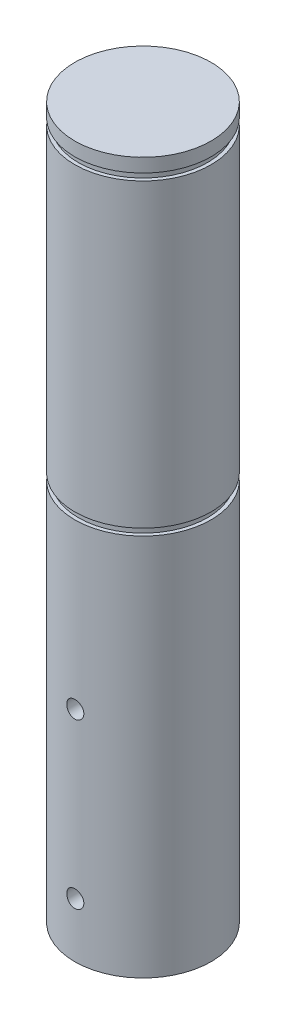
ISO-10303-21;
HEADER;
FILE_DESCRIPTION(('STEP AP214'),'2;1');
FILE_NAME('part.step','',(''),(''),'','','');
FILE_SCHEMA(('AUTOMOTIVE_DESIGN { 1 0 10303 214 1 1 1 1 }'));
ENDSEC;
DATA;
#1=APPLICATION_CONTEXT('core data for automotive mechanical design processes');
#2=APPLICATION_PROTOCOL_DEFINITION('international standard','automotive_design',2000,#1);
#3=PRODUCT_CONTEXT('',#1,'mechanical');
#4=PRODUCT('Part','Part','',(#3));
#5=PRODUCT_RELATED_PRODUCT_CATEGORY('part','',(#4));
#6=PRODUCT_DEFINITION_FORMATION('','',#4);
#7=PRODUCT_DEFINITION_CONTEXT('part definition',#1,'design');
#8=PRODUCT_DEFINITION('design','',#6,#7);
#9=PRODUCT_DEFINITION_SHAPE('','',#8);
#10=(LENGTH_UNIT() NAMED_UNIT(*) SI_UNIT(.MILLI.,.METRE.));
#11=(NAMED_UNIT(*) PLANE_ANGLE_UNIT() SI_UNIT($,.RADIAN.));
#12=(NAMED_UNIT(*) SI_UNIT($,.STERADIAN.) SOLID_ANGLE_UNIT());
#13=UNCERTAINTY_MEASURE_WITH_UNIT(LENGTH_MEASURE(1.E-05),#10,'distance_accuracy_value','');
#14=(GEOMETRIC_REPRESENTATION_CONTEXT(3) GLOBAL_UNCERTAINTY_ASSIGNED_CONTEXT((#13)) GLOBAL_UNIT_ASSIGNED_CONTEXT((#10,
#11,#12)) REPRESENTATION_CONTEXT('',''));
#15=CARTESIAN_POINT('',(0.,0.,0.));
#16=DIRECTION('',(0.,0.,1.));
#17=DIRECTION('',(1.,0.,0.));
#18=AXIS2_PLACEMENT_3D('',#15,#16,#17);
#19=CARTESIAN_POINT('',(5.9,40.,0.));
#20=DIRECTION('',(0.,-1.,0.));
#21=DIRECTION('',(0.,0.,-1.));
#22=AXIS2_PLACEMENT_3D('',#19,#20,#21);
#23=CYLINDRICAL_SURFACE('',#22,9.975);
#24=CARTESIAN_POINT('',(7.14999999999999,32.,9.89636928373229));
#25=CARTESIAN_POINT('',(7.1499970283447,31.9300833414179,9.89637029027922));
#26=CARTESIAN_POINT('',(7.14411419874699,31.8601230204867,9.8971182134243));
#27=CARTESIAN_POINT('',(7.12073950074832,31.7221494896786,9.90002795154952));
#28=CARTESIAN_POINT('',(7.10323551057745,31.6541383903444,9.9021912428339));
#29=CARTESIAN_POINT('',(7.05714271229177,31.5220809048803,9.9076829276249));
#30=CARTESIAN_POINT('',(7.02856143874438,31.4580318580989,9.91101052903963));
#31=CARTESIAN_POINT('',(6.96114153202213,31.3356510610332,9.91845494288647));
#32=CARTESIAN_POINT('',(6.92230464845048,31.2773183378714,9.92257162066965));
#33=CARTESIAN_POINT('',(6.83524200067201,31.1676860877441,9.93115626879556));
#34=CARTESIAN_POINT('',(6.78697005757892,31.1164233589458,9.93562589976023));
#35=CARTESIAN_POINT('',(6.68250695601071,31.0227041303424,9.94439790566478));
#36=CARTESIAN_POINT('',(6.62631540332684,30.9802480691608,9.94870027226523));
#37=CARTESIAN_POINT('',(6.50737685159458,30.9052153336054,9.95666998231355));
#38=CARTESIAN_POINT('',(6.44460868417862,30.8726719656389,9.96033516752334));
#39=CARTESIAN_POINT('',(6.31444444345565,30.8186017408368,9.96659929565377));
#40=CARTESIAN_POINT('',(6.24704854284342,30.7970744731625,9.96919827833707));
#41=CARTESIAN_POINT('',(6.1099183035879,30.7657574838292,9.97302547146744));
#42=CARTESIAN_POINT('',(6.04019813959725,30.7559065813251,9.97426082458248));
#43=CARTESIAN_POINT('',(5.90008406437168,30.7480323410411,9.97524595887896));
#44=CARTESIAN_POINT('',(5.82969017987683,30.7500085357699,9.97499579877849));
#45=CARTESIAN_POINT('',(5.6906431567777,30.7656833698157,9.97304387151047));
#46=CARTESIAN_POINT('',(5.62198247014743,30.7793162101421,9.97135025249718));
#47=CARTESIAN_POINT('',(5.48793122151045,30.8178144869098,9.96671085904859));
#48=CARTESIAN_POINT('',(5.42254072196122,30.8426801377962,9.96376506070804));
#49=CARTESIAN_POINT('',(5.2966823965895,30.903008133759,9.95693827490821));
#50=CARTESIAN_POINT('',(5.23622835700076,30.9384989449637,9.95305478072153));
#51=CARTESIAN_POINT('',(5.1221094064899,31.0190490982288,9.94478706200592));
#52=CARTESIAN_POINT('',(5.0684448086722,31.0641088813192,9.94040281440179));
#53=CARTESIAN_POINT('',(4.96904150466671,31.1628864004973,9.93158867353793));
#54=CARTESIAN_POINT('',(4.92335977306565,31.2166614816039,9.92715867360013));
#55=CARTESIAN_POINT('',(4.84166176864237,31.3311461501859,9.91878203674371));
#56=CARTESIAN_POINT('',(4.80564552639193,31.3918557595943,9.91483540135399));
#57=CARTESIAN_POINT('',(4.74429755648802,31.5185370312003,9.90787238224742));
#58=CARTESIAN_POINT('',(4.71897040835255,31.5845109344104,9.90485639739673));
#59=CARTESIAN_POINT('',(4.67977017918331,31.7198215917879,9.90010392173831));
#60=CARTESIAN_POINT('',(4.66589654327606,31.7891581828753,9.89836736894803));
#61=CARTESIAN_POINT('',(4.650072646411,31.9287227652017,9.89638170552555));
#62=CARTESIAN_POINT('',(4.64804219769883,31.9989415277933,9.89612259173059));
#63=CARTESIAN_POINT('',(4.65575072105685,32.1387182250505,9.89709468636235));
#64=CARTESIAN_POINT('',(4.66548944097695,32.2082761738416,9.89832586286014));
#65=CARTESIAN_POINT('',(4.6963923335546,32.3445163480421,9.90213068596447));
#66=CARTESIAN_POINT('',(4.71751766463547,32.4112075222375,9.90469976775729));
#67=CARTESIAN_POINT('',(4.77055412052297,32.5401010131235,9.91088722671078));
#68=CARTESIAN_POINT('',(4.80246562607962,32.6023031712586,9.91450564091206));
#69=CARTESIAN_POINT('',(4.8763656857776,32.7208156946304,9.9224080146963));
#70=CARTESIAN_POINT('',(4.91840681727025,32.7770930421168,9.92669540423953));
#71=CARTESIAN_POINT('',(5.01129842499678,32.8818215184391,9.93544188060135));
#72=CARTESIAN_POINT('',(5.06214924564345,32.9302723411557,9.93990097412738));
#73=CARTESIAN_POINT('',(5.17156708661045,33.0182541864652,9.9485191618182));
#74=CARTESIAN_POINT('',(5.23017664761915,33.0577325125455,9.95267639075669));
#75=CARTESIAN_POINT('',(5.3532414192776,33.1262840624968,9.96019453238923));
#76=CARTESIAN_POINT('',(5.41769651156175,33.1553574969964,9.9635554612025));
#77=CARTESIAN_POINT('',(5.55044771284479,33.2021869895519,9.96909403707554));
#78=CARTESIAN_POINT('',(5.61873294689531,33.2199734840144,9.97127486404064));
#79=CARTESIAN_POINT('',(5.75734977621292,33.2438232085716,9.97422072125044));
#80=CARTESIAN_POINT('',(5.82768127856816,33.2498869701024,9.9749858156756));
#81=CARTESIAN_POINT('',(5.96787968460525,33.2501091344703,9.97501369603767));
#82=CARTESIAN_POINT('',(6.03774647142491,33.2443487863141,9.97428673459431));
#83=CARTESIAN_POINT('',(6.17551064167589,33.2212583515877,9.97143256952396));
#84=CARTESIAN_POINT('',(6.24340802652484,33.203928273346,9.96930536690495));
#85=CARTESIAN_POINT('',(6.37529525577404,33.1582158661868,9.96388868054675));
#86=CARTESIAN_POINT('',(6.43928647382998,33.1298374487699,9.96059960818845));
#87=CARTESIAN_POINT('',(6.56161124521582,33.0628423428094,9.95322334649757));
#88=CARTESIAN_POINT('',(6.61994472990657,33.0242255300756,9.94913614748399));
#89=CARTESIAN_POINT('',(6.72971321168902,32.9375492979116,9.94058633582477));
#90=CARTESIAN_POINT('',(6.78110029984582,32.8894294282882,9.93612143028526));
#91=CARTESIAN_POINT('',(6.87510201651803,32.7852385867877,9.92733780933374));
#92=CARTESIAN_POINT('',(6.9177145644813,32.7291657344704,9.92301912879585));
#93=CARTESIAN_POINT('',(6.99309908666283,32.6104109960841,9.91499906324853));
#94=CARTESIAN_POINT('',(7.02583222962051,32.5477043060522,9.91130013889378));
#95=CARTESIAN_POINT('',(7.08025694494854,32.4176726857271,9.9049672377916));
#96=CARTESIAN_POINT('',(7.1019605200242,32.3503528665412,9.9023321040406));
#97=CARTESIAN_POINT('',(7.12851713552893,32.2355709802675,9.8990646113699));
#98=CARTESIAN_POINT('',(7.13656161589011,32.1888327428218,9.89805890119124));
#99=CARTESIAN_POINT('',(7.14730403455405,32.0947363502476,9.89671089886953));
#100=CARTESIAN_POINT('',(7.15000201370718,32.0473781998584,9.89636860165763));
#101=CARTESIAN_POINT('',(7.14999999999999,32.,9.89636928373229));
#102=B_SPLINE_CURVE_WITH_KNOTS('',3,(#24,#25,#26,#27,#28,#29,#30,#31,#32,#33,#34,#35,#36,#37,
#38,#39,#40,#41,#42,#43,#44,#45,#46,#47,#48,#49,#50,#51,#52,#53,#54,#55,#56,#57,#58,#59,#60,#61,
#62,#63,#64,#65,#66,#67,#68,#69,#70,#71,#72,#73,#74,#75,#76,#77,#78,#79,#80,#81,#82,#83,#84,#85,
#86,#87,#88,#89,#90,#91,#92,#93,#94,#95,#96,#97,#98,#99,#100,#101),.UNSPECIFIED.,.T.,.F.,(4,2,2,
2,2,2,2,2,2,2,2,2,2,2,2,2,2,2,2,2,2,2,2,2,2,2,2,2,2,2,2,2,2,2,2,2,2,2,4),(0.,0.209576893950373,
0.419372736994427,0.629026130436636,0.838643780169881,1.04931430241201,1.25999531475615,
1.47137659408022,1.68274998949545,1.89301088214847,2.1032634638445,2.31233699613348,
2.52141452000644,2.73105727909714,2.9407097026304,3.15180221829761,3.36289540163883,
3.57407893184076,3.78525223050709,3.99499404375141,4.20473136343458,4.41375772154063,
4.62279145901034,4.83293447881054,5.04308571595898,5.25444101494127,5.46579203516542,
5.67657067602574,5.88733976126653,6.09666540227375,6.30599089259876,6.51524234163158,
6.72449632896824,6.93512696888195,7.14580749456507,7.35730563319072,7.56857311770126,
7.71059151554434,7.85260882828005),.UNSPECIFIED.);
#103=CARTESIAN_POINT('',(7.14999999999999,32.,9.89636928373229));
#104=VERTEX_POINT('',#103);
#105=EDGE_CURVE('E11',#104,#104,#102,.T.);
#106=ORIENTED_EDGE('',*,*,#105,.T.);
#107=EDGE_LOOP('',(#106));
#108=FACE_BOUND('',#107,.T.);
#109=CARTESIAN_POINT('',(7.14999999999999,8.,9.89636928373229));
#110=CARTESIAN_POINT('',(7.1499970283447,7.9300833414179,9.89637029027922));
#111=CARTESIAN_POINT('',(7.14411419874699,7.86012302048667,9.8971182134243));
#112=CARTESIAN_POINT('',(7.12073950074832,7.72214948967865,9.90002795154952));
#113=CARTESIAN_POINT('',(7.10323551057745,7.65413839034441,9.9021912428339));
#114=CARTESIAN_POINT('',(7.05714271229177,7.52208090488033,9.9076829276249));
#115=CARTESIAN_POINT('',(7.02856143874439,7.45803185809891,9.91101052903963));
#116=CARTESIAN_POINT('',(6.96114153202214,7.33565106103318,9.91845494288647));
#117=CARTESIAN_POINT('',(6.92230464845049,7.27731833787137,9.92257162066965));
#118=CARTESIAN_POINT('',(6.83524200067201,7.16768608774415,9.93115626879556));
#119=CARTESIAN_POINT('',(6.78697005757892,7.11642335894578,9.93562589976023));
#120=CARTESIAN_POINT('',(6.68250695601071,7.02270413034242,9.94439790566478));
#121=CARTESIAN_POINT('',(6.62631540332684,6.98024806916079,9.94870027226523));
#122=CARTESIAN_POINT('',(6.50737685159458,6.90521533360536,9.95666998231355));
#123=CARTESIAN_POINT('',(6.44460868417862,6.87267196563892,9.96033516752334));
#124=CARTESIAN_POINT('',(6.31444444345564,6.81860174083684,9.96659929565377));
#125=CARTESIAN_POINT('',(6.24704854284342,6.79707447316253,9.96919827833707));
#126=CARTESIAN_POINT('',(6.10991830358791,6.7657574838292,9.97302547146744));
#127=CARTESIAN_POINT('',(6.04019813959725,6.75590658132508,9.97426082458248));
#128=CARTESIAN_POINT('',(5.90008406437169,6.74803234104109,9.97524595887896));
#129=CARTESIAN_POINT('',(5.82969017987683,6.75000853576988,9.97499579877849));
#130=CARTESIAN_POINT('',(5.6906431567777,6.76568336981567,9.97304387151047));
#131=CARTESIAN_POINT('',(5.62198247014744,6.77931621014213,9.97135025249718));
#132=CARTESIAN_POINT('',(5.48793122151045,6.81781448690983,9.96671085904859));
#133=CARTESIAN_POINT('',(5.42254072196122,6.84268013779624,9.96376506070804));
#134=CARTESIAN_POINT('',(5.2966823965895,6.90300813375903,9.95693827490821));
#135=CARTESIAN_POINT('',(5.23622835700077,6.93849894496366,9.95305478072153));
#136=CARTESIAN_POINT('',(5.1221094064899,7.01904909822882,9.94478706200592));
#137=CARTESIAN_POINT('',(5.0684448086722,7.06410888131917,9.94040281440179));
#138=CARTESIAN_POINT('',(4.96904150466671,7.16288640049734,9.93158867353793));
#139=CARTESIAN_POINT('',(4.92335977306565,7.21666148160393,9.92715867360013));
#140=CARTESIAN_POINT('',(4.84166176864237,7.33114615018593,9.91878203674371));
#141=CARTESIAN_POINT('',(4.80564552639193,7.39185575959426,9.91483540135399));
#142=CARTESIAN_POINT('',(4.74429755648802,7.5185370312003,9.90787238224742));
#143=CARTESIAN_POINT('',(4.71897040835255,7.58451093441035,9.90485639739673));
#144=CARTESIAN_POINT('',(4.67977017918331,7.71982159178788,9.90010392173831));
#145=CARTESIAN_POINT('',(4.66589654327606,7.78915818287526,9.89836736894803));
#146=CARTESIAN_POINT('',(4.650072646411,7.92872276520167,9.89638170552555));
#147=CARTESIAN_POINT('',(4.64804219769883,7.99894152779329,9.8961225917306));
#148=CARTESIAN_POINT('',(4.65575072105685,8.13871822505048,9.89709468636235));
#149=CARTESIAN_POINT('',(4.66548944097694,8.20827617384157,9.89832586286014));
#150=CARTESIAN_POINT('',(4.6963923335546,8.34451634804212,9.90213068596447));
#151=CARTESIAN_POINT('',(4.71751766463547,8.41120752223746,9.90469976775729));
#152=CARTESIAN_POINT('',(4.77055412052297,8.54010101312347,9.91088722671078));
#153=CARTESIAN_POINT('',(4.80246562607961,8.60230317125861,9.91450564091207));
#154=CARTESIAN_POINT('',(4.87636568577759,8.72081569463042,9.9224080146963));
#155=CARTESIAN_POINT('',(4.91840681727025,8.77709304211681,9.92669540423952));
#156=CARTESIAN_POINT('',(5.01129842499677,8.88182151843913,9.93544188060135));
#157=CARTESIAN_POINT('',(5.06214924564344,8.93027234115569,9.93990097412737));
#158=CARTESIAN_POINT('',(5.17156708661045,9.01825418646523,9.9485191618182));
#159=CARTESIAN_POINT('',(5.23017664761915,9.05773251254554,9.95267639075669));
#160=CARTESIAN_POINT('',(5.3532414192776,9.12628406249678,9.96019453238923));
#161=CARTESIAN_POINT('',(5.41769651156175,9.15535749699644,9.9635554612025));
#162=CARTESIAN_POINT('',(5.55044771284479,9.2021869895519,9.96909403707554));
#163=CARTESIAN_POINT('',(5.61873294689531,9.21997348401435,9.97127486404064));
#164=CARTESIAN_POINT('',(5.75734977621292,9.24382320857161,9.97422072125044));
#165=CARTESIAN_POINT('',(5.82768127856816,9.24988697010238,9.9749858156756));
#166=CARTESIAN_POINT('',(5.96787968460525,9.25010913447029,9.97501369603767));
#167=CARTESIAN_POINT('',(6.03774647142491,9.24434878631406,9.9742867345943));
#168=CARTESIAN_POINT('',(6.17551064167589,9.22125835158772,9.97143256952396));
#169=CARTESIAN_POINT('',(6.24340802652484,9.20392827334604,9.96930536690495));
#170=CARTESIAN_POINT('',(6.37529525577404,9.1582158661868,9.96388868054675));
#171=CARTESIAN_POINT('',(6.43928647382998,9.12983744876986,9.96059960818845));
#172=CARTESIAN_POINT('',(6.56161124521582,9.06284234280936,9.95322334649757));
#173=CARTESIAN_POINT('',(6.61994472990657,9.02422553007565,9.94913614748399));
#174=CARTESIAN_POINT('',(6.72971321168902,8.93754929791162,9.94058633582477));
#175=CARTESIAN_POINT('',(6.78110029984582,8.88942942828818,9.93612143028527));
#176=CARTESIAN_POINT('',(6.87510201651803,8.78523858678765,9.92733780933374));
#177=CARTESIAN_POINT('',(6.91771456448129,8.72916573447037,9.92301912879585));
#178=CARTESIAN_POINT('',(6.99309908666283,8.61041099608409,9.91499906324853));
#179=CARTESIAN_POINT('',(7.02583222962051,8.5477043060522,9.91130013889378));
#180=CARTESIAN_POINT('',(7.08025694494854,8.41767268572709,9.9049672377916));
#181=CARTESIAN_POINT('',(7.1019605200242,8.35035286654118,9.9023321040406));
#182=CARTESIAN_POINT('',(7.12851713552893,8.23557098026751,9.8990646113699));
#183=CARTESIAN_POINT('',(7.13656161589011,8.18883274282181,9.89805890119124));
#184=CARTESIAN_POINT('',(7.14730403455405,8.09473635024763,9.89671089886953));
#185=CARTESIAN_POINT('',(7.15000201370718,8.04737819985843,9.89636860165763));
#186=CARTESIAN_POINT('',(7.14999999999999,8.,9.89636928373229));
#187=B_SPLINE_CURVE_WITH_KNOTS('',3,(#109,#110,#111,#112,#113,#114,#115,#116,#117,#118,#119,
#120,#121,#122,#123,#124,#125,#126,#127,#128,#129,#130,#131,#132,#133,#134,#135,#136,#137,#138,
#139,#140,#141,#142,#143,#144,#145,#146,#147,#148,#149,#150,#151,#152,#153,#154,#155,#156,#157,
#158,#159,#160,#161,#162,#163,#164,#165,#166,#167,#168,#169,#170,#171,#172,#173,#174,#175,#176,
#177,#178,#179,#180,#181,#182,#183,#184,#185,#186),.UNSPECIFIED.,.T.,.F.,(4,2,2,2,2,2,2,2,2,2,2,
2,2,2,2,2,2,2,2,2,2,2,2,2,2,2,2,2,2,2,2,2,2,2,2,2,2,2,4),(0.,0.209576893950373,
0.419372736994425,0.62902613043662,0.83864378016988,1.04931430241201,1.25999531475616,
1.47137659408022,1.68274998949545,1.89301088214846,2.1032634638445,2.31233699613348,
2.52141452000644,2.73105727909714,2.9407097026304,3.1518022182976,3.36289540163882,
3.57407893184075,3.78525223050708,3.9949940437514,4.20473136343457,4.41375772154062,
4.62279145901033,4.83293447881053,5.04308571595897,5.25444101494126,5.46579203516542,
5.67657067602574,5.88733976126653,6.09666540227375,6.30599089259876,6.51524234163158,
6.72449632896824,6.93512696888195,7.14580749456507,7.35730563319072,7.56857311770126,
7.71059151554434,7.85260882828005),.UNSPECIFIED.);
#188=CARTESIAN_POINT('',(7.14999999999999,8.,9.89636928373229));
#189=VERTEX_POINT('',#188);
#190=EDGE_CURVE('E50',#189,#189,#187,.T.);
#191=ORIENTED_EDGE('',*,*,#190,.T.);
#192=EDGE_LOOP('',(#191));
#193=FACE_BOUND('',#192,.T.);
#194=CARTESIAN_POINT('',(5.9,0.,0.));
#195=DIRECTION('',(0.,1.,0.));
#196=DIRECTION('',(0.,0.,1.));
#197=AXIS2_PLACEMENT_3D('',#194,#195,#196);
#198=CIRCLE('',#197,9.975);
#199=CARTESIAN_POINT('',(5.9,0.,9.975));
#200=VERTEX_POINT('',#199);
#201=EDGE_CURVE('E97',#200,#200,#198,.T.);
#202=ORIENTED_EDGE('',*,*,#201,.T.);
#203=EDGE_LOOP('',(#202));
#204=FACE_BOUND('',#203,.T.);
#205=CARTESIAN_POINT('',(5.9,56.,0.));
#206=DIRECTION('',(0.,1.,0.));
#207=DIRECTION('',(0.,0.,1.));
#208=AXIS2_PLACEMENT_3D('',#205,#206,#207);
#209=CIRCLE('',#208,9.975);
#210=CARTESIAN_POINT('',(5.9,56.,9.975));
#211=VERTEX_POINT('',#210);
#212=EDGE_CURVE('E92',#211,#211,#209,.T.);
#213=ORIENTED_EDGE('',*,*,#212,.F.);
#214=EDGE_LOOP('',(#213));
#215=FACE_BOUND('',#214,.T.);
#216=ADVANCED_FACE('F39',(#108,#193,#204,#215),#23,.T.);
#217=CARTESIAN_POINT('',(5.9,0.,0.));
#218=DIRECTION('',(0.,1.,0.));
#219=DIRECTION('',(0.,0.,1.));
#220=AXIS2_PLACEMENT_3D('',#217,#218,#219);
#221=PLANE('',#220);
#222=ORIENTED_EDGE('',*,*,#201,.F.);
#223=EDGE_LOOP('',(#222));
#224=FACE_BOUND('',#223,.T.);
#225=ADVANCED_FACE('F145',(#224),#221,.F.);
#226=CARTESIAN_POINT('',(5.9,56.,0.));
#227=DIRECTION('',(0.,1.,0.));
#228=DIRECTION('',(0.,0.,1.));
#229=AXIS2_PLACEMENT_3D('',#226,#227,#228);
#230=PLANE('',#229);
#231=CARTESIAN_POINT('',(5.9,56.,0.));
#232=DIRECTION('',(0.,1.,0.));
#233=DIRECTION('',(0.,0.,1.));
#234=AXIS2_PLACEMENT_3D('',#231,#232,#233);
#235=CIRCLE('',#234,9.45);
#236=CARTESIAN_POINT('',(5.9,56.,9.45));
#237=VERTEX_POINT('',#236);
#238=EDGE_CURVE('E86',#237,#237,#235,.T.);
#239=ORIENTED_EDGE('',*,*,#238,.F.);
#240=EDGE_LOOP('',(#239));
#241=FACE_BOUND('',#240,.T.);
#242=ORIENTED_EDGE('',*,*,#212,.T.);
#243=EDGE_LOOP('',(#242));
#244=FACE_BOUND('',#243,.T.);
#245=ADVANCED_FACE('F142',(#241,#244),#230,.T.);
#246=CARTESIAN_POINT('',(5.9,57.,0.));
#247=DIRECTION('',(0.,-1.,0.));
#248=DIRECTION('',(0.,0.,-1.));
#249=AXIS2_PLACEMENT_3D('',#246,#247,#248);
#250=CYLINDRICAL_SURFACE('',#249,9.45);
#251=CARTESIAN_POINT('',(5.9,57.,0.));
#252=DIRECTION('',(0.,1.,0.));
#253=DIRECTION('',(0.,0.,1.));
#254=AXIS2_PLACEMENT_3D('',#251,#252,#253);
#255=CIRCLE('',#254,9.45);
#256=CARTESIAN_POINT('',(5.9,57.,9.45));
#257=VERTEX_POINT('',#256);
#258=EDGE_CURVE('E89',#257,#257,#255,.T.);
#259=ORIENTED_EDGE('',*,*,#258,.F.);
#260=EDGE_LOOP('',(#259));
#261=FACE_BOUND('',#260,.T.);
#262=ORIENTED_EDGE('',*,*,#238,.T.);
#263=EDGE_LOOP('',(#262));
#264=FACE_BOUND('',#263,.T.);
#265=ADVANCED_FACE('F138',(#261,#264),#250,.T.);
#266=CARTESIAN_POINT('',(5.9,101.,0.));
#267=DIRECTION('',(0.,-1.,0.));
#268=DIRECTION('',(0.,0.,-1.));
#269=AXIS2_PLACEMENT_3D('',#266,#267,#268);
#270=CYLINDRICAL_SURFACE('',#269,9.975);
#271=CARTESIAN_POINT('',(5.9,101.,0.));
#272=DIRECTION('',(0.,1.,0.));
#273=DIRECTION('',(0.,0.,1.));
#274=AXIS2_PLACEMENT_3D('',#271,#272,#273);
#275=CIRCLE('',#274,9.975);
#276=CARTESIAN_POINT('',(5.9,101.,9.975));
#277=VERTEX_POINT('',#276);
#278=EDGE_CURVE('E83',#277,#277,#275,.T.);
#279=ORIENTED_EDGE('',*,*,#278,.F.);
#280=EDGE_LOOP('',(#279));
#281=FACE_BOUND('',#280,.T.);
#282=CARTESIAN_POINT('',(5.9,57.,0.));
#283=DIRECTION('',(0.,1.,0.));
#284=DIRECTION('',(0.,0.,1.));
#285=AXIS2_PLACEMENT_3D('',#282,#283,#284);
#286=CIRCLE('',#285,9.975);
#287=CARTESIAN_POINT('',(5.9,57.,9.975));
#288=VERTEX_POINT('',#287);
#289=EDGE_CURVE('E80',#288,#288,#286,.T.);
#290=ORIENTED_EDGE('',*,*,#289,.T.);
#291=EDGE_LOOP('',(#290));
#292=FACE_BOUND('',#291,.T.);
#293=ADVANCED_FACE('F131',(#281,#292),#270,.T.);
#294=CARTESIAN_POINT('',(5.9,101.,0.));
#295=DIRECTION('',(0.,1.,0.));
#296=DIRECTION('',(0.,0.,1.));
#297=AXIS2_PLACEMENT_3D('',#294,#295,#296);
#298=PLANE('',#297);
#299=CARTESIAN_POINT('',(5.9,101.,0.));
#300=DIRECTION('',(0.,1.,0.));
#301=DIRECTION('',(0.,0.,1.));
#302=AXIS2_PLACEMENT_3D('',#299,#300,#301);
#303=CIRCLE('',#302,9.45);
#304=CARTESIAN_POINT('',(5.9,101.,9.45));
#305=VERTEX_POINT('',#304);
#306=EDGE_CURVE('E74',#305,#305,#303,.T.);
#307=ORIENTED_EDGE('',*,*,#306,.F.);
#308=EDGE_LOOP('',(#307));
#309=FACE_BOUND('',#308,.T.);
#310=ORIENTED_EDGE('',*,*,#278,.T.);
#311=EDGE_LOOP('',(#310));
#312=FACE_BOUND('',#311,.T.);
#313=ADVANCED_FACE('F128',(#309,#312),#298,.T.);
#314=CARTESIAN_POINT('',(5.9,57.,0.));
#315=DIRECTION('',(0.,1.,0.));
#316=DIRECTION('',(0.,0.,1.));
#317=AXIS2_PLACEMENT_3D('',#314,#315,#316);
#318=PLANE('',#317);
#319=ORIENTED_EDGE('',*,*,#258,.T.);
#320=EDGE_LOOP('',(#319));
#321=FACE_BOUND('',#320,.T.);
#322=ORIENTED_EDGE('',*,*,#289,.F.);
#323=EDGE_LOOP('',(#322));
#324=FACE_BOUND('',#323,.T.);
#325=ADVANCED_FACE('F126',(#321,#324),#318,.F.);
#326=CARTESIAN_POINT('',(5.9,102.,0.));
#327=DIRECTION('',(0.,-1.,0.));
#328=DIRECTION('',(0.,0.,-1.));
#329=AXIS2_PLACEMENT_3D('',#326,#327,#328);
#330=CYLINDRICAL_SURFACE('',#329,9.45);
#331=CARTESIAN_POINT('',(5.9,102.,0.));
#332=DIRECTION('',(0.,1.,0.));
#333=DIRECTION('',(0.,0.,1.));
#334=AXIS2_PLACEMENT_3D('',#331,#332,#333);
#335=CIRCLE('',#334,9.45);
#336=CARTESIAN_POINT('',(5.9,102.,9.45));
#337=VERTEX_POINT('',#336);
#338=EDGE_CURVE('E77',#337,#337,#335,.T.);
#339=ORIENTED_EDGE('',*,*,#338,.F.);
#340=EDGE_LOOP('',(#339));
#341=FACE_BOUND('',#340,.T.);
#342=ORIENTED_EDGE('',*,*,#306,.T.);
#343=EDGE_LOOP('',(#342));
#344=FACE_BOUND('',#343,.T.);
#345=ADVANCED_FACE('F122',(#341,#344),#330,.T.);
#346=CARTESIAN_POINT('',(5.9,104.,0.));
#347=DIRECTION('',(0.,-1.,0.));
#348=DIRECTION('',(0.,0.,-1.));
#349=AXIS2_PLACEMENT_3D('',#346,#347,#348);
#350=CYLINDRICAL_SURFACE('',#349,9.975);
#351=CARTESIAN_POINT('',(5.9,104.,0.));
#352=DIRECTION('',(0.,1.,0.));
#353=DIRECTION('',(0.,0.,1.));
#354=AXIS2_PLACEMENT_3D('',#351,#352,#353);
#355=CIRCLE('',#354,9.975);
#356=CARTESIAN_POINT('',(5.9,104.,9.975));
#357=VERTEX_POINT('',#356);
#358=EDGE_CURVE('E71',#357,#357,#355,.T.);
#359=ORIENTED_EDGE('',*,*,#358,.F.);
#360=EDGE_LOOP('',(#359));
#361=FACE_BOUND('',#360,.T.);
#362=CARTESIAN_POINT('',(5.9,102.,0.));
#363=DIRECTION('',(0.,1.,0.));
#364=DIRECTION('',(0.,0.,1.));
#365=AXIS2_PLACEMENT_3D('',#362,#363,#364);
#366=CIRCLE('',#365,9.975);
#367=CARTESIAN_POINT('',(5.9,102.,9.975));
#368=VERTEX_POINT('',#367);
#369=EDGE_CURVE('E68',#368,#368,#366,.T.);
#370=ORIENTED_EDGE('',*,*,#369,.T.);
#371=EDGE_LOOP('',(#370));
#372=FACE_BOUND('',#371,.T.);
#373=ADVANCED_FACE('F115',(#361,#372),#350,.T.);
#374=CARTESIAN_POINT('',(5.9,104.,0.));
#375=DIRECTION('',(0.,1.,0.));
#376=DIRECTION('',(0.,0.,1.));
#377=AXIS2_PLACEMENT_3D('',#374,#375,#376);
#378=PLANE('',#377);
#379=ORIENTED_EDGE('',*,*,#358,.T.);
#380=EDGE_LOOP('',(#379));
#381=FACE_BOUND('',#380,.T.);
#382=ADVANCED_FACE('F112',(#381),#378,.T.);
#383=CARTESIAN_POINT('',(5.9,102.,0.));
#384=DIRECTION('',(0.,1.,0.));
#385=DIRECTION('',(0.,0.,1.));
#386=AXIS2_PLACEMENT_3D('',#383,#384,#385);
#387=PLANE('',#386);
#388=ORIENTED_EDGE('',*,*,#338,.T.);
#389=EDGE_LOOP('',(#388));
#390=FACE_BOUND('',#389,.T.);
#391=ORIENTED_EDGE('',*,*,#369,.F.);
#392=EDGE_LOOP('',(#391));
#393=FACE_BOUND('',#392,.T.);
#394=ADVANCED_FACE('F108',(#390,#393),#387,.F.);
#395=CARTESIAN_POINT('',(5.9,8.,9.975));
#396=DIRECTION('',(0.,0.,1.));
#397=DIRECTION('',(1.,0.,0.));
#398=AXIS2_PLACEMENT_3D('',#395,#396,#397);
#399=CYLINDRICAL_SURFACE('',#398,1.24999999999999);
#400=CARTESIAN_POINT('',(5.9,8.,2.47500000000001));
#401=DIRECTION('',(0.,0.,1.));
#402=DIRECTION('',(1.,0.,0.));
#403=AXIS2_PLACEMENT_3D('',#400,#401,#402);
#404=CIRCLE('',#403,1.24999999999999);
#405=CARTESIAN_POINT('',(7.14999999999999,8.,2.47500000000001));
#406=VERTEX_POINT('',#405);
#407=EDGE_CURVE('E65',#406,#406,#404,.T.);
#408=ORIENTED_EDGE('',*,*,#407,.F.);
#409=EDGE_LOOP('',(#408));
#410=FACE_BOUND('',#409,.T.);
#411=ORIENTED_EDGE('',*,*,#190,.F.);
#412=EDGE_LOOP('',(#411));
#413=FACE_BOUND('',#412,.T.);
#414=ADVANCED_FACE('F103',(#410,#413),#399,.F.);
#415=CARTESIAN_POINT('',(5.9,8.,2.47500000000001));
#416=DIRECTION('',(0.,0.,1.));
#417=DIRECTION('',(1.,0.,0.));
#418=AXIS2_PLACEMENT_3D('',#415,#416,#417);
#419=CONICAL_SURFACE('',#418,1.24999999999999,1.02974425867664);
#420=CARTESIAN_POINT('',(5.9,8.,1.72392422621555));
#421=VERTEX_POINT('',#420);
#422=VERTEX_LOOP('',#421);
#423=FACE_BOUND('',#422,.T.);
#424=ORIENTED_EDGE('',*,*,#407,.T.);
#425=EDGE_LOOP('',(#424));
#426=FACE_BOUND('',#425,.T.);
#427=ADVANCED_FACE('F107',(#423,#426),#419,.F.);
#428=CARTESIAN_POINT('',(5.9,32.,9.975));
#429=DIRECTION('',(0.,0.,1.));
#430=DIRECTION('',(1.,0.,0.));
#431=AXIS2_PLACEMENT_3D('',#428,#429,#430);
#432=CYLINDRICAL_SURFACE('',#431,1.24999999999999);
#433=CARTESIAN_POINT('',(5.9,32.,2.47500000000001));
#434=DIRECTION('',(0.,0.,1.));
#435=DIRECTION('',(1.,0.,0.));
#436=AXIS2_PLACEMENT_3D('',#433,#434,#435);
#437=CIRCLE('',#436,1.24999999999999);
#438=CARTESIAN_POINT('',(7.14999999999999,32.,2.47500000000001));
#439=VERTEX_POINT('',#438);
#440=EDGE_CURVE('E63',#439,#439,#437,.T.);
#441=ORIENTED_EDGE('',*,*,#440,.F.);
#442=EDGE_LOOP('',(#441));
#443=FACE_BOUND('',#442,.T.);
#444=ORIENTED_EDGE('',*,*,#105,.F.);
#445=EDGE_LOOP('',(#444));
#446=FACE_BOUND('',#445,.T.);
#447=ADVANCED_FACE('F59',(#443,#446),#432,.F.);
#448=CARTESIAN_POINT('',(5.9,32.,2.47500000000001));
#449=DIRECTION('',(0.,0.,1.));
#450=DIRECTION('',(1.,0.,0.));
#451=AXIS2_PLACEMENT_3D('',#448,#449,#450);
#452=CONICAL_SURFACE('',#451,1.24999999999999,1.02974425867664);
#453=CARTESIAN_POINT('',(5.9,32.,1.72392422621555));
#454=VERTEX_POINT('',#453);
#455=VERTEX_LOOP('',#454);
#456=FACE_BOUND('',#455,.T.);
#457=ORIENTED_EDGE('',*,*,#440,.T.);
#458=EDGE_LOOP('',(#457));
#459=FACE_BOUND('',#458,.T.);
#460=ADVANCED_FACE('F56',(#456,#459),#452,.F.);
#461=CLOSED_SHELL('',(#216,#225,#245,#265,#293,#313,#325,#345,#373,#382,#394,#414,#427,#447,#460));
#462=MANIFOLD_SOLID_BREP('B2',#461);
#463=ADVANCED_BREP_SHAPE_REPRESENTATION('',(#18,#462),#14);
#464=SHAPE_DEFINITION_REPRESENTATION(#9,#463);
ENDSEC;
END-ISO-10303-21;
